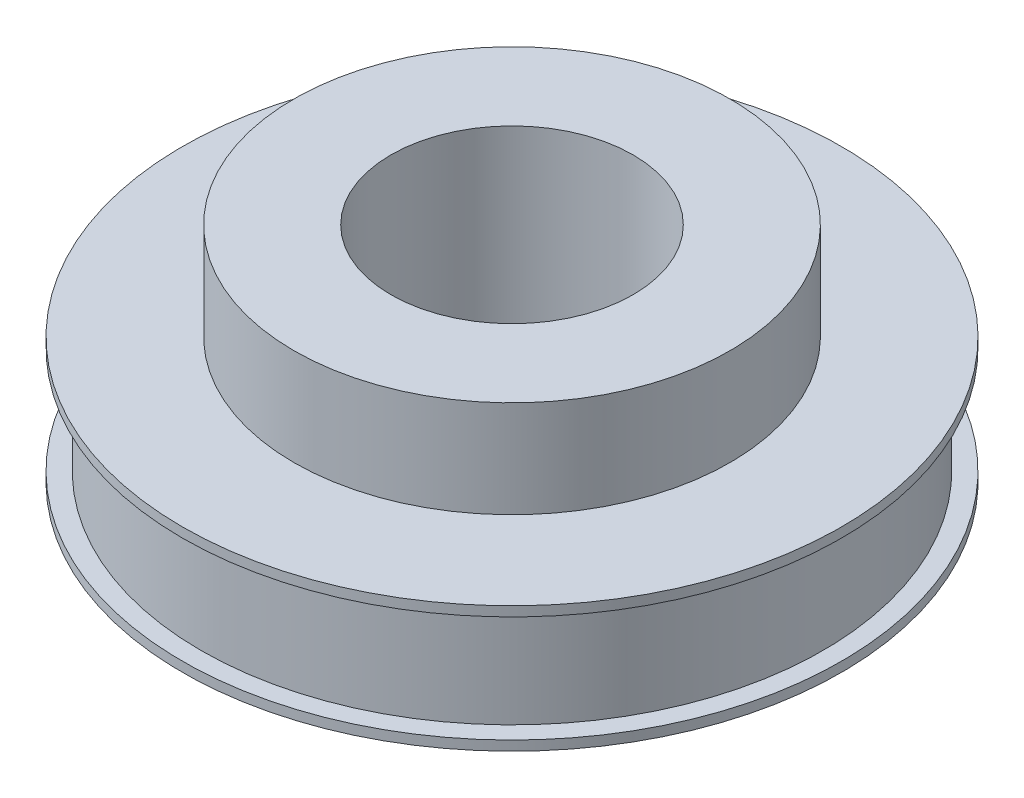
ISO-10303-21;
HEADER;
FILE_DESCRIPTION(('STEP AP214'),'2;1');
FILE_NAME('part.step','',(''),(''),'','','');
FILE_SCHEMA(('AUTOMOTIVE_DESIGN { 1 0 10303 214 1 1 1 1 }'));
ENDSEC;
DATA;
#1=APPLICATION_CONTEXT('core data for automotive mechanical design processes');
#2=APPLICATION_PROTOCOL_DEFINITION('international standard','automotive_design',2000,#1);
#3=PRODUCT_CONTEXT('',#1,'mechanical');
#4=PRODUCT('Part','Part','',(#3));
#5=PRODUCT_RELATED_PRODUCT_CATEGORY('part','',(#4));
#6=PRODUCT_DEFINITION_FORMATION('','',#4);
#7=PRODUCT_DEFINITION_CONTEXT('part definition',#1,'design');
#8=PRODUCT_DEFINITION('design','',#6,#7);
#9=PRODUCT_DEFINITION_SHAPE('','',#8);
#10=(LENGTH_UNIT() NAMED_UNIT(*) SI_UNIT(.MILLI.,.METRE.));
#11=(NAMED_UNIT(*) PLANE_ANGLE_UNIT() SI_UNIT($,.RADIAN.));
#12=(NAMED_UNIT(*) SI_UNIT($,.STERADIAN.) SOLID_ANGLE_UNIT());
#13=UNCERTAINTY_MEASURE_WITH_UNIT(LENGTH_MEASURE(1.E-05),#10,'distance_accuracy_value','');
#14=(GEOMETRIC_REPRESENTATION_CONTEXT(3) GLOBAL_UNCERTAINTY_ASSIGNED_CONTEXT((#13)) GLOBAL_UNIT_ASSIGNED_CONTEXT((#10,
#11,#12)) REPRESENTATION_CONTEXT('',''));
#15=CARTESIAN_POINT('',(0.,0.,0.));
#16=DIRECTION('',(0.,0.,1.));
#17=DIRECTION('',(1.,0.,0.));
#18=AXIS2_PLACEMENT_3D('',#15,#16,#17);
#19=CARTESIAN_POINT('',(0.,12.,0.));
#20=DIRECTION('',(0.,1.,0.));
#21=DIRECTION('',(0.,0.,1.));
#22=AXIS2_PLACEMENT_3D('',#19,#20,#21);
#23=PLANE('',#22);
#24=CARTESIAN_POINT('',(0.,12.,0.));
#25=DIRECTION('',(0.,1.,0.));
#26=DIRECTION('',(0.,0.,1.));
#27=AXIS2_PLACEMENT_3D('',#24,#25,#26);
#28=CIRCLE('',#27,34.);
#29=CARTESIAN_POINT('',(0.,12.,34.));
#30=VERTEX_POINT('',#29);
#31=EDGE_CURVE('E45',#30,#30,#28,.T.);
#32=ORIENTED_EDGE('',*,*,#31,.T.);
#33=EDGE_LOOP('',(#32));
#34=FACE_BOUND('',#33,.T.);
#35=CARTESIAN_POINT('',(0.,12.,0.));
#36=DIRECTION('',(0.,1.,0.));
#37=DIRECTION('',(0.,0.,1.));
#38=AXIS2_PLACEMENT_3D('',#35,#36,#37);
#39=CIRCLE('',#38,22.5);
#40=CARTESIAN_POINT('',(0.,12.,22.5));
#41=VERTEX_POINT('',#40);
#42=EDGE_CURVE('E64',#41,#41,#39,.T.);
#43=ORIENTED_EDGE('',*,*,#42,.F.);
#44=EDGE_LOOP('',(#43));
#45=FACE_BOUND('',#44,.T.);
#46=ADVANCED_FACE('F37',(#34,#45),#23,.T.);
#47=CARTESIAN_POINT('',(0.,11.,0.));
#48=DIRECTION('',(0.,-1.,0.));
#49=DIRECTION('',(0.,0.,-1.));
#50=AXIS2_PLACEMENT_3D('',#47,#48,#49);
#51=CYLINDRICAL_SURFACE('',#50,32.085);
#52=CARTESIAN_POINT('',(0.,11.,0.));
#53=DIRECTION('',(0.,1.,0.));
#54=DIRECTION('',(0.,0.,1.));
#55=AXIS2_PLACEMENT_3D('',#52,#53,#54);
#56=CIRCLE('',#55,32.085);
#57=CARTESIAN_POINT('',(0.,11.,32.085));
#58=VERTEX_POINT('',#57);
#59=EDGE_CURVE('E10',#58,#58,#56,.T.);
#60=ORIENTED_EDGE('',*,*,#59,.F.);
#61=EDGE_LOOP('',(#60));
#62=FACE_BOUND('',#61,.T.);
#63=CARTESIAN_POINT('',(0.,0.,0.));
#64=DIRECTION('',(0.,1.,0.));
#65=DIRECTION('',(0.,0.,1.));
#66=AXIS2_PLACEMENT_3D('',#63,#64,#65);
#67=CIRCLE('',#66,32.085);
#68=CARTESIAN_POINT('',(0.,0.,32.085));
#69=VERTEX_POINT('',#68);
#70=EDGE_CURVE('E41',#69,#69,#67,.T.);
#71=ORIENTED_EDGE('',*,*,#70,.T.);
#72=EDGE_LOOP('',(#71));
#73=FACE_BOUND('',#72,.T.);
#74=ADVANCED_FACE('F39',(#62,#73),#51,.T.);
#75=CARTESIAN_POINT('',(0.,12.,0.));
#76=DIRECTION('',(0.,-1.,0.));
#77=DIRECTION('',(0.,0.,-1.));
#78=AXIS2_PLACEMENT_3D('',#75,#76,#77);
#79=CYLINDRICAL_SURFACE('',#78,34.);
#80=ORIENTED_EDGE('',*,*,#31,.F.);
#81=EDGE_LOOP('',(#80));
#82=FACE_BOUND('',#81,.T.);
#83=CARTESIAN_POINT('',(0.,11.,0.));
#84=DIRECTION('',(0.,1.,0.));
#85=DIRECTION('',(0.,0.,1.));
#86=AXIS2_PLACEMENT_3D('',#83,#84,#85);
#87=CIRCLE('',#86,34.);
#88=CARTESIAN_POINT('',(0.,11.,34.));
#89=VERTEX_POINT('',#88);
#90=EDGE_CURVE('E49',#89,#89,#87,.T.);
#91=ORIENTED_EDGE('',*,*,#90,.T.);
#92=EDGE_LOOP('',(#91));
#93=FACE_BOUND('',#92,.T.);
#94=ADVANCED_FACE('F95',(#82,#93),#79,.T.);
#95=CARTESIAN_POINT('',(0.,11.,0.));
#96=DIRECTION('',(0.,1.,0.));
#97=DIRECTION('',(0.,0.,1.));
#98=AXIS2_PLACEMENT_3D('',#95,#96,#97);
#99=PLANE('',#98);
#100=ORIENTED_EDGE('',*,*,#59,.T.);
#101=EDGE_LOOP('',(#100));
#102=FACE_BOUND('',#101,.T.);
#103=ORIENTED_EDGE('',*,*,#90,.F.);
#104=EDGE_LOOP('',(#103));
#105=FACE_BOUND('',#104,.T.);
#106=ADVANCED_FACE('F102',(#102,#105),#99,.F.);
#107=CARTESIAN_POINT('',(0.,-1.,0.));
#108=DIRECTION('',(0.,1.,0.));
#109=DIRECTION('',(0.,0.,1.));
#110=AXIS2_PLACEMENT_3D('',#107,#108,#109);
#111=CYLINDRICAL_SURFACE('',#110,34.);
#112=CARTESIAN_POINT('',(0.,-1.,0.));
#113=DIRECTION('',(0.,-1.,0.));
#114=DIRECTION('',(0.,0.,-1.));
#115=AXIS2_PLACEMENT_3D('',#112,#113,#114);
#116=CIRCLE('',#115,34.);
#117=CARTESIAN_POINT('',(0.,-1.,-34.));
#118=VERTEX_POINT('',#117);
#119=EDGE_CURVE('E57',#118,#118,#116,.T.);
#120=ORIENTED_EDGE('',*,*,#119,.F.);
#121=EDGE_LOOP('',(#120));
#122=FACE_BOUND('',#121,.T.);
#123=CARTESIAN_POINT('',(0.,0.,0.));
#124=DIRECTION('',(0.,-1.,0.));
#125=DIRECTION('',(0.,0.,-1.));
#126=AXIS2_PLACEMENT_3D('',#123,#124,#125);
#127=CIRCLE('',#126,34.);
#128=CARTESIAN_POINT('',(0.,0.,-34.));
#129=VERTEX_POINT('',#128);
#130=EDGE_CURVE('E54',#129,#129,#127,.T.);
#131=ORIENTED_EDGE('',*,*,#130,.T.);
#132=EDGE_LOOP('',(#131));
#133=FACE_BOUND('',#132,.T.);
#134=ADVANCED_FACE('F100',(#122,#133),#111,.T.);
#135=CARTESIAN_POINT('',(0.,-1.,0.));
#136=DIRECTION('',(0.,-1.,0.));
#137=DIRECTION('',(0.,0.,-1.));
#138=AXIS2_PLACEMENT_3D('',#135,#136,#137);
#139=PLANE('',#138);
#140=CARTESIAN_POINT('',(0.,-1.,0.));
#141=DIRECTION('',(0.,1.,0.));
#142=DIRECTION('',(0.,0.,1.));
#143=AXIS2_PLACEMENT_3D('',#140,#141,#142);
#144=CIRCLE('',#143,12.5);
#145=CARTESIAN_POINT('',(0.,-1.,12.5));
#146=VERTEX_POINT('',#145);
#147=EDGE_CURVE('E58',#146,#146,#144,.T.);
#148=ORIENTED_EDGE('',*,*,#147,.T.);
#149=EDGE_LOOP('',(#148));
#150=FACE_BOUND('',#149,.T.);
#151=ORIENTED_EDGE('',*,*,#119,.T.);
#152=EDGE_LOOP('',(#151));
#153=FACE_BOUND('',#152,.T.);
#154=ADVANCED_FACE('F124',(#150,#153),#139,.T.);
#155=CARTESIAN_POINT('',(0.,0.,0.));
#156=DIRECTION('',(0.,-1.,0.));
#157=DIRECTION('',(0.,0.,-1.));
#158=AXIS2_PLACEMENT_3D('',#155,#156,#157);
#159=PLANE('',#158);
#160=ORIENTED_EDGE('',*,*,#70,.F.);
#161=EDGE_LOOP('',(#160));
#162=FACE_BOUND('',#161,.T.);
#163=ORIENTED_EDGE('',*,*,#130,.F.);
#164=EDGE_LOOP('',(#163));
#165=FACE_BOUND('',#164,.T.);
#166=ADVANCED_FACE('F86',(#162,#165),#159,.F.);
#167=CARTESIAN_POINT('',(0.,-1.,0.));
#168=DIRECTION('',(0.,1.,0.));
#169=DIRECTION('',(0.,0.,1.));
#170=AXIS2_PLACEMENT_3D('',#167,#168,#169);
#171=CYLINDRICAL_SURFACE('',#170,12.5);
#172=ORIENTED_EDGE('',*,*,#147,.F.);
#173=EDGE_LOOP('',(#172));
#174=FACE_BOUND('',#173,.T.);
#175=CARTESIAN_POINT('',(0.,22.,0.));
#176=DIRECTION('',(0.,1.,0.));
#177=DIRECTION('',(0.,0.,1.));
#178=AXIS2_PLACEMENT_3D('',#175,#176,#177);
#179=CIRCLE('',#178,12.5);
#180=CARTESIAN_POINT('',(0.,22.,12.5));
#181=VERTEX_POINT('',#180);
#182=EDGE_CURVE('E67',#181,#181,#179,.T.);
#183=ORIENTED_EDGE('',*,*,#182,.T.);
#184=EDGE_LOOP('',(#183));
#185=FACE_BOUND('',#184,.T.);
#186=ADVANCED_FACE('F73',(#174,#185),#171,.F.);
#187=CARTESIAN_POINT('',(0.,22.,0.));
#188=DIRECTION('',(0.,1.,0.));
#189=DIRECTION('',(0.,0.,1.));
#190=AXIS2_PLACEMENT_3D('',#187,#188,#189);
#191=PLANE('',#190);
#192=CARTESIAN_POINT('',(0.,22.,0.));
#193=DIRECTION('',(0.,1.,0.));
#194=DIRECTION('',(0.,0.,1.));
#195=AXIS2_PLACEMENT_3D('',#192,#193,#194);
#196=CIRCLE('',#195,22.5);
#197=CARTESIAN_POINT('',(0.,22.,22.5));
#198=VERTEX_POINT('',#197);
#199=EDGE_CURVE('E63',#198,#198,#196,.T.);
#200=ORIENTED_EDGE('',*,*,#199,.T.);
#201=EDGE_LOOP('',(#200));
#202=FACE_BOUND('',#201,.T.);
#203=ORIENTED_EDGE('',*,*,#182,.F.);
#204=EDGE_LOOP('',(#203));
#205=FACE_BOUND('',#204,.T.);
#206=ADVANCED_FACE('F75',(#202,#205),#191,.T.);
#207=CARTESIAN_POINT('',(0.,22.,0.));
#208=DIRECTION('',(0.,-1.,0.));
#209=DIRECTION('',(0.,0.,-1.));
#210=AXIS2_PLACEMENT_3D('',#207,#208,#209);
#211=CYLINDRICAL_SURFACE('',#210,22.5);
#212=ORIENTED_EDGE('',*,*,#199,.F.);
#213=EDGE_LOOP('',(#212));
#214=FACE_BOUND('',#213,.T.);
#215=ORIENTED_EDGE('',*,*,#42,.T.);
#216=EDGE_LOOP('',(#215));
#217=FACE_BOUND('',#216,.T.);
#218=ADVANCED_FACE('F77',(#214,#217),#211,.T.);
#219=CLOSED_SHELL('',(#46,#74,#94,#106,#134,#154,#166,#186,#206,#218));
#220=MANIFOLD_SOLID_BREP('B2',#219);
#221=ADVANCED_BREP_SHAPE_REPRESENTATION('',(#18,#220),#14);
#222=SHAPE_DEFINITION_REPRESENTATION(#9,#221);
ENDSEC;
END-ISO-10303-21;
